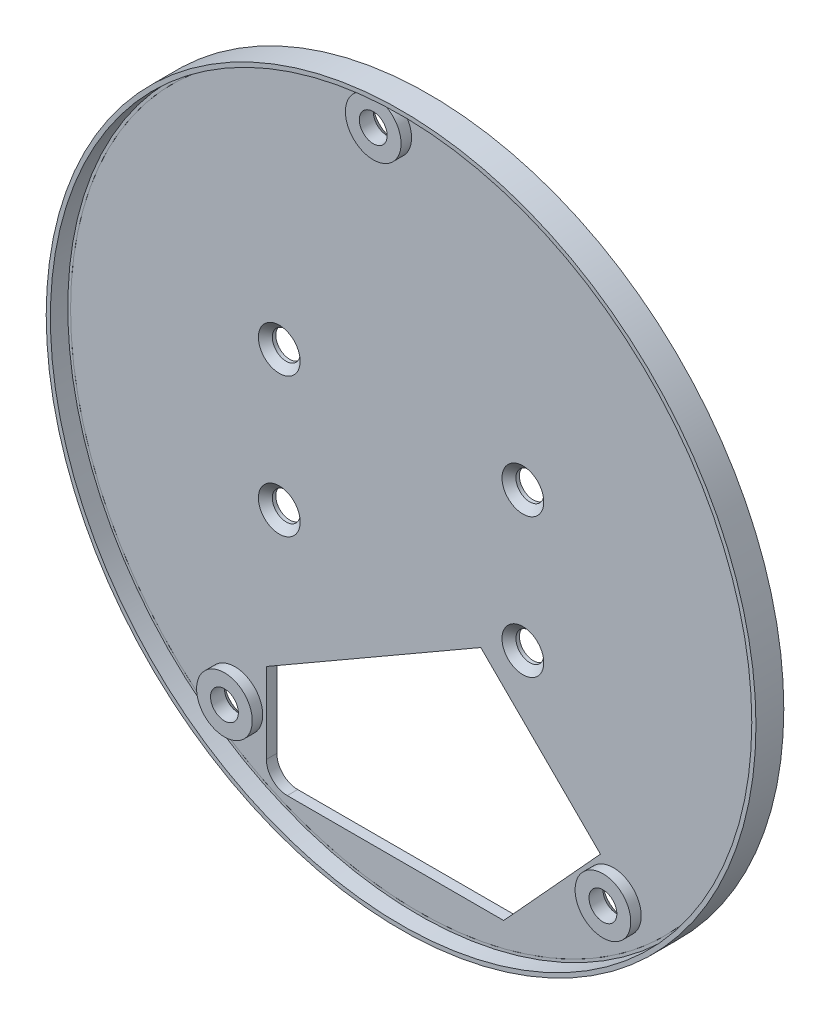
ISO-10303-21;
HEADER;
FILE_DESCRIPTION(('STEP AP214'),'2;1');
FILE_NAME('part.step','',(''),(''),'','','');
FILE_SCHEMA(('AUTOMOTIVE_DESIGN { 1 0 10303 214 1 1 1 1 }'));
ENDSEC;
DATA;
#1=APPLICATION_CONTEXT('core data for automotive mechanical design processes');
#2=APPLICATION_PROTOCOL_DEFINITION('international standard','automotive_design',2000,#1);
#3=PRODUCT_CONTEXT('',#1,'mechanical');
#4=PRODUCT('Part','Part','',(#3));
#5=PRODUCT_RELATED_PRODUCT_CATEGORY('part','',(#4));
#6=PRODUCT_DEFINITION_FORMATION('','',#4);
#7=PRODUCT_DEFINITION_CONTEXT('part definition',#1,'design');
#8=PRODUCT_DEFINITION('design','',#6,#7);
#9=PRODUCT_DEFINITION_SHAPE('','',#8);
#10=(LENGTH_UNIT() NAMED_UNIT(*) SI_UNIT(.MILLI.,.METRE.));
#11=(NAMED_UNIT(*) PLANE_ANGLE_UNIT() SI_UNIT($,.RADIAN.));
#12=(NAMED_UNIT(*) SI_UNIT($,.STERADIAN.) SOLID_ANGLE_UNIT());
#13=UNCERTAINTY_MEASURE_WITH_UNIT(LENGTH_MEASURE(1.E-05),#10,'distance_accuracy_value','');
#14=(GEOMETRIC_REPRESENTATION_CONTEXT(3) GLOBAL_UNCERTAINTY_ASSIGNED_CONTEXT((#13)) GLOBAL_UNIT_ASSIGNED_CONTEXT((#10,
#11,#12)) REPRESENTATION_CONTEXT('',''));
#15=CARTESIAN_POINT('',(0.,0.,0.));
#16=DIRECTION('',(0.,0.,1.));
#17=DIRECTION('',(1.,0.,0.));
#18=AXIS2_PLACEMENT_3D('',#15,#16,#17);
#19=CARTESIAN_POINT('',(10.4557775510678,108.290889666324,1.));
#20=DIRECTION('',(0.,0.,-1.));
#21=DIRECTION('',(-1.,0.,0.));
#22=AXIS2_PLACEMENT_3D('',#19,#20,#21);
#23=CYLINDRICAL_SURFACE('',#22,49.987399034794);
#24=CARTESIAN_POINT('',(10.4557775510678,108.290889666324,-3.));
#25=DIRECTION('',(0.,0.,1.));
#26=DIRECTION('',(1.,0.,0.));
#27=AXIS2_PLACEMENT_3D('',#24,#25,#26);
#28=CIRCLE('',#27,49.987399034794);
#29=CARTESIAN_POINT('',(60.4431765858618,108.290889666324,-3.));
#30=VERTEX_POINT('',#29);
#31=EDGE_CURVE('E56',#30,#30,#28,.T.);
#32=ORIENTED_EDGE('',*,*,#31,.F.);
#33=EDGE_LOOP('',(#32));
#34=FACE_BOUND('',#33,.T.);
#35=CARTESIAN_POINT('',(10.4557775510678,108.290889666324,-1.5));
#36=DIRECTION('',(0.,0.,1.));
#37=DIRECTION('',(1.,0.,0.));
#38=AXIS2_PLACEMENT_3D('',#35,#36,#37);
#39=CIRCLE('',#38,49.987399034794);
#40=CARTESIAN_POINT('',(60.4431765858618,108.290889666324,-1.5));
#41=VERTEX_POINT('',#40);
#42=EDGE_CURVE('E47',#41,#41,#39,.T.);
#43=ORIENTED_EDGE('',*,*,#42,.T.);
#44=EDGE_LOOP('',(#43));
#45=FACE_BOUND('',#44,.T.);
#46=ADVANCED_FACE('F43',(#34,#45),#23,.F.);
#47=CARTESIAN_POINT('',(10.4557775510678,108.290889666324,1.));
#48=DIRECTION('',(0.,0.,1.));
#49=DIRECTION('',(1.,0.,0.));
#50=AXIS2_PLACEMENT_3D('',#47,#48,#49);
#51=PLANE('',#50);
#52=CARTESIAN_POINT('',(10.4557775510678,108.290889666324,1.));
#53=DIRECTION('',(0.,0.,1.));
#54=DIRECTION('',(1.,0.,0.));
#55=AXIS2_PLACEMENT_3D('',#52,#53,#54);
#56=CIRCLE('',#55,50.387399034794);
#57=CARTESIAN_POINT('',(60.8431765858618,108.290889666324,1.));
#58=VERTEX_POINT('',#57);
#59=EDGE_CURVE('E60',#58,#58,#56,.T.);
#60=ORIENTED_EDGE('',*,*,#59,.F.);
#61=EDGE_LOOP('',(#60));
#62=FACE_BOUND('',#61,.T.);
#63=CARTESIAN_POINT('',(10.4557775510678,108.290889666324,1.));
#64=DIRECTION('',(0.,0.,1.));
#65=DIRECTION('',(1.,0.,0.));
#66=AXIS2_PLACEMENT_3D('',#63,#64,#65);
#67=CIRCLE('',#66,50.987399034794);
#68=CARTESIAN_POINT('',(61.4431765858618,108.290889666324,1.));
#69=VERTEX_POINT('',#68);
#70=EDGE_CURVE('E11',#69,#69,#67,.T.);
#71=ORIENTED_EDGE('',*,*,#70,.T.);
#72=EDGE_LOOP('',(#71));
#73=FACE_BOUND('',#72,.T.);
#74=ADVANCED_FACE('F81',(#62,#73),#51,.T.);
#75=CARTESIAN_POINT('',(10.4557775510678,108.290889666324,-3.));
#76=DIRECTION('',(0.,0.,1.));
#77=DIRECTION('',(1.,0.,0.));
#78=AXIS2_PLACEMENT_3D('',#75,#76,#77);
#79=PLANE('',#78);
#80=CARTESIAN_POINT('',(10.4557775510678,108.290889666324,-3.));
#81=DIRECTION('',(0.,0.,1.));
#82=DIRECTION('',(1.,0.,0.));
#83=AXIS2_PLACEMENT_3D('',#80,#81,#82);
#84=CIRCLE('',#83,50.987399034794);
#85=CARTESIAN_POINT('',(61.4431765858618,108.290889666324,-3.));
#86=VERTEX_POINT('',#85);
#87=EDGE_CURVE('E51',#86,#86,#84,.T.);
#88=ORIENTED_EDGE('',*,*,#87,.F.);
#89=EDGE_LOOP('',(#88));
#90=FACE_BOUND('',#89,.T.);
#91=ORIENTED_EDGE('',*,*,#31,.T.);
#92=EDGE_LOOP('',(#91));
#93=FACE_BOUND('',#92,.T.);
#94=ADVANCED_FACE('F87',(#90,#93),#79,.F.);
#95=CARTESIAN_POINT('',(10.4557775510678,108.290889666324,1.));
#96=DIRECTION('',(0.,0.,-1.));
#97=DIRECTION('',(-1.,0.,0.));
#98=AXIS2_PLACEMENT_3D('',#95,#96,#97);
#99=CYLINDRICAL_SURFACE('',#98,50.987399034794);
#100=ORIENTED_EDGE('',*,*,#70,.F.);
#101=EDGE_LOOP('',(#100));
#102=FACE_BOUND('',#101,.T.);
#103=ORIENTED_EDGE('',*,*,#87,.T.);
#104=EDGE_LOOP('',(#103));
#105=FACE_BOUND('',#104,.T.);
#106=ADVANCED_FACE('F45',(#102,#105),#99,.T.);
#107=CARTESIAN_POINT('',(10.4557775510678,108.290889666324,-1.5));
#108=DIRECTION('',(0.,0.,1.));
#109=DIRECTION('',(1.,0.,0.));
#110=AXIS2_PLACEMENT_3D('',#107,#108,#109);
#111=CYLINDRICAL_SURFACE('',#110,50.387399034794);
#112=CARTESIAN_POINT('',(10.4557775510678,108.290889666324,-1.5));
#113=DIRECTION('',(0.,0.,1.));
#114=DIRECTION('',(1.,0.,0.));
#115=AXIS2_PLACEMENT_3D('',#112,#113,#114);
#116=CIRCLE('',#115,50.387399034794);
#117=CARTESIAN_POINT('',(60.8431765858618,108.290889666324,-1.5));
#118=VERTEX_POINT('',#117);
#119=EDGE_CURVE('E63',#118,#118,#116,.T.);
#120=ORIENTED_EDGE('',*,*,#119,.F.);
#121=EDGE_LOOP('',(#120));
#122=FACE_BOUND('',#121,.T.);
#123=ORIENTED_EDGE('',*,*,#59,.T.);
#124=EDGE_LOOP('',(#123));
#125=FACE_BOUND('',#124,.T.);
#126=ADVANCED_FACE('F73',(#122,#125),#111,.F.);
#127=CARTESIAN_POINT('',(10.4557775510678,108.290889666324,-1.5));
#128=DIRECTION('',(0.,0.,1.));
#129=DIRECTION('',(1.,0.,0.));
#130=AXIS2_PLACEMENT_3D('',#127,#128,#129);
#131=PLANE('',#130);
#132=ORIENTED_EDGE('',*,*,#42,.F.);
#133=EDGE_LOOP('',(#132));
#134=FACE_BOUND('',#133,.T.);
#135=ORIENTED_EDGE('',*,*,#119,.T.);
#136=EDGE_LOOP('',(#135));
#137=FACE_BOUND('',#136,.T.);
#138=ADVANCED_FACE('F71',(#134,#137),#131,.T.);
#139=CLOSED_SHELL('',(#46,#74,#94,#106,#126,#138));
#140=MANIFOLD_SOLID_BREP('B2',#139);
#141=CARTESIAN_POINT('',(5.45576739104778,154.110981106507,0.));
#142=DIRECTION('',(0.,0.,-1.));
#143=DIRECTION('',(-1.,0.,0.));
#144=AXIS2_PLACEMENT_3D('',#141,#142,#143);
#145=PLANE('',#144);
#146=CARTESIAN_POINT('',(5.45576739104778,154.110981106507,0.));
#147=DIRECTION('',(0.,0.,-1.));
#148=DIRECTION('',(-1.,0.,0.));
#149=AXIS2_PLACEMENT_3D('',#146,#147,#148);
#150=CIRCLE('',#149,2.);
#151=CARTESIAN_POINT('',(3.45576739104778,154.110981106507,0.));
#152=VERTEX_POINT('',#151);
#153=EDGE_CURVE('E437',#152,#152,#150,.T.);
#154=ORIENTED_EDGE('',*,*,#153,.T.);
#155=EDGE_LOOP('',(#154));
#156=FACE_BOUND('',#155,.T.);
#157=CARTESIAN_POINT('',(10.4557775510678,108.290889666324,0.));
#158=DIRECTION('',(0.,0.,-1.));
#159=DIRECTION('',(-1.,0.,0.));
#160=AXIS2_PLACEMENT_3D('',#157,#158,#159);
#161=CIRCLE('',#160,49.9095993276444);
#162=CARTESIAN_POINT('',(3.80786198381975,157.755759257346,0.));
#163=VERTEX_POINT('',#162);
#164=CARTESIAN_POINT('',(6.27879379099904,158.025393903465,0.));
#165=VERTEX_POINT('',#164);
#166=EDGE_CURVE('E202',#163,#165,#161,.T.);
#167=ORIENTED_EDGE('',*,*,#166,.F.);
#168=CARTESIAN_POINT('',(5.45576739104778,154.110981106507,0.));
#169=DIRECTION('',(0.,0.,-1.));
#170=DIRECTION('',(-1.,0.,0.));
#171=AXIS2_PLACEMENT_3D('',#168,#169,#170);
#172=CIRCLE('',#171,4.);
#173=EDGE_CURVE('E439',#165,#163,#172,.T.);
#174=ORIENTED_EDGE('',*,*,#173,.F.);
#175=EDGE_LOOP('',(#167,#174));
#176=FACE_BOUND('',#175,.T.);
#177=ADVANCED_FACE('F135',(#156,#176),#145,.F.);
#178=CARTESIAN_POINT('',(5.45576739104778,154.110981106507,-1.5));
#179=DIRECTION('',(0.,0.,1.));
#180=DIRECTION('',(1.,0.,0.));
#181=AXIS2_PLACEMENT_3D('',#178,#179,#180);
#182=CYLINDRICAL_SURFACE('',#181,4.);
#183=DIRECTION('',(0.,0.,1.));
#184=VECTOR('',#183,1.);
#185=CARTESIAN_POINT('',(6.27879379099904,158.025393903465,-0.25));
#186=LINE('',#185,#184);
#187=CARTESIAN_POINT('',(6.27879379099904,158.025393903465,-1.5));
#188=VERTEX_POINT('',#187);
#189=EDGE_CURVE('E199',#165,#188,#186,.F.);
#190=ORIENTED_EDGE('',*,*,#189,.F.);
#191=ORIENTED_EDGE('',*,*,#173,.T.);
#192=DIRECTION('',(0.,0.,1.));
#193=VECTOR('',#192,1.);
#194=CARTESIAN_POINT('',(3.80786198381975,157.755759257346,-0.25));
#195=LINE('',#194,#193);
#196=CARTESIAN_POINT('',(3.80786198381975,157.755759257346,-1.5));
#197=VERTEX_POINT('',#196);
#198=EDGE_CURVE('E208',#197,#163,#195,.T.);
#199=ORIENTED_EDGE('',*,*,#198,.F.);
#200=CARTESIAN_POINT('',(5.45576739104778,154.110981106507,-1.5));
#201=DIRECTION('',(0.,0.,-1.));
#202=DIRECTION('',(-1.,0.,0.));
#203=AXIS2_PLACEMENT_3D('',#200,#201,#202);
#204=CIRCLE('',#203,4.);
#205=EDGE_CURVE('E214',#197,#188,#204,.F.);
#206=ORIENTED_EDGE('',*,*,#205,.T.);
#207=EDGE_LOOP('',(#190,#191,#199,#206));
#208=FACE_BOUND('',#207,.T.);
#209=ADVANCED_FACE('F217',(#208),#182,.T.);
#210=CARTESIAN_POINT('',(-15.9242757890322,71.6108160061844,0.));
#211=DIRECTION('',(0.,0.,-1.));
#212=DIRECTION('',(-1.,0.,0.));
#213=AXIS2_PLACEMENT_3D('',#210,#211,#212);
#214=PLANE('',#213);
#215=CARTESIAN_POINT('',(-15.9242757890322,71.6108160061844,0.));
#216=DIRECTION('',(0.,0.,-1.));
#217=DIRECTION('',(-1.,0.,0.));
#218=AXIS2_PLACEMENT_3D('',#215,#216,#217);
#219=CIRCLE('',#218,4.00000000000001);
#220=CARTESIAN_POINT('',(-19.9242757890322,71.6108160061844,0.));
#221=VERTEX_POINT('',#220);
#222=EDGE_CURVE('E456',#221,#221,#219,.T.);
#223=ORIENTED_EDGE('',*,*,#222,.F.);
#224=EDGE_LOOP('',(#223));
#225=FACE_BOUND('',#224,.T.);
#226=CARTESIAN_POINT('',(-15.9242757890322,71.6108160061844,0.));
#227=DIRECTION('',(0.,0.,-1.));
#228=DIRECTION('',(-1.,0.,0.));
#229=AXIS2_PLACEMENT_3D('',#226,#227,#228);
#230=CIRCLE('',#229,2.00000381001);
#231=CARTESIAN_POINT('',(-17.9242795990422,71.6108160061844,0.));
#232=VERTEX_POINT('',#231);
#233=EDGE_CURVE('E451',#232,#232,#230,.T.);
#234=ORIENTED_EDGE('',*,*,#233,.T.);
#235=EDGE_LOOP('',(#234));
#236=FACE_BOUND('',#235,.T.);
#237=ADVANCED_FACE('F286',(#225,#236),#214,.F.);
#238=CARTESIAN_POINT('',(-15.9242757890322,71.6108160061844,-1.5));
#239=DIRECTION('',(0.,0.,1.));
#240=DIRECTION('',(1.,0.,0.));
#241=AXIS2_PLACEMENT_3D('',#238,#239,#240);
#242=CYLINDRICAL_SURFACE('',#241,4.00000000000001);
#243=CARTESIAN_POINT('',(-15.9242757890322,71.6108160061844,-1.5));
#244=DIRECTION('',(0.,0.,-1.));
#245=DIRECTION('',(-1.,0.,0.));
#246=AXIS2_PLACEMENT_3D('',#243,#244,#245);
#247=CIRCLE('',#246,4.00000000000001);
#248=CARTESIAN_POINT('',(-19.9242757890322,71.6108160061844,-1.5));
#249=VERTEX_POINT('',#248);
#250=EDGE_CURVE('E225',#249,#249,#247,.T.);
#251=ORIENTED_EDGE('',*,*,#250,.F.);
#252=EDGE_LOOP('',(#251));
#253=FACE_BOUND('',#252,.T.);
#254=ORIENTED_EDGE('',*,*,#222,.T.);
#255=EDGE_LOOP('',(#254));
#256=FACE_BOUND('',#255,.T.);
#257=ADVANCED_FACE('F320',(#253,#256),#242,.T.);
#258=CARTESIAN_POINT('',(-15.9242757890322,71.6108160061844,-1.5));
#259=DIRECTION('',(0.,0.,1.));
#260=DIRECTION('',(1.,0.,0.));
#261=AXIS2_PLACEMENT_3D('',#258,#259,#260);
#262=CYLINDRICAL_SURFACE('',#261,2.00000381001);
#263=CARTESIAN_POINT('',(-15.9242757890322,71.6108160061844,-2.00000000000003));
#264=DIRECTION('',(0.,0.,-1.));
#265=DIRECTION('',(-1.,0.,0.));
#266=AXIS2_PLACEMENT_3D('',#263,#264,#265);
#267=CIRCLE('',#266,2.00000381001);
#268=CARTESIAN_POINT('',(-17.9242795990422,71.6108160061844,-2.00000000000003));
#269=VERTEX_POINT('',#268);
#270=EDGE_CURVE('E237',#269,#269,#267,.T.);
#271=ORIENTED_EDGE('',*,*,#270,.T.);
#272=EDGE_LOOP('',(#271));
#273=FACE_BOUND('',#272,.T.);
#274=ORIENTED_EDGE('',*,*,#233,.F.);
#275=EDGE_LOOP('',(#274));
#276=FACE_BOUND('',#275,.T.);
#277=ADVANCED_FACE('F316',(#273,#276),#262,.F.);
#278=CARTESIAN_POINT('',(10.4557775510678,108.290889666324,-3.));
#279=DIRECTION('',(0.,0.,1.));
#280=DIRECTION('',(1.,0.,0.));
#281=AXIS2_PLACEMENT_3D('',#278,#279,#280);
#282=CYLINDRICAL_SURFACE('',#281,49.987399034794);
#283=CARTESIAN_POINT('',(10.4557775510678,108.290889666324,-3.));
#284=DIRECTION('',(0.,0.,-1.));
#285=DIRECTION('',(-1.,0.,0.));
#286=AXIS2_PLACEMENT_3D('',#283,#284,#285);
#287=CIRCLE('',#286,49.987399034794);
#288=CARTESIAN_POINT('',(-39.5316214837262,108.290889666324,-3.));
#289=VERTEX_POINT('',#288);
#290=EDGE_CURVE('E448',#289,#289,#287,.T.);
#291=ORIENTED_EDGE('',*,*,#290,.F.);
#292=EDGE_LOOP('',(#291));
#293=FACE_BOUND('',#292,.T.);
#294=CARTESIAN_POINT('',(10.4557775510678,108.290889666324,-1.5));
#295=DIRECTION('',(0.,0.,-1.));
#296=DIRECTION('',(-1.,0.,0.));
#297=AXIS2_PLACEMENT_3D('',#294,#295,#296);
#298=CIRCLE('',#297,49.987399034794);
#299=CARTESIAN_POINT('',(-39.5316214837262,108.290889666324,-1.5));
#300=VERTEX_POINT('',#299);
#301=EDGE_CURVE('E447',#300,#300,#298,.T.);
#302=ORIENTED_EDGE('',*,*,#301,.T.);
#303=EDGE_LOOP('',(#302));
#304=FACE_BOUND('',#303,.T.);
#305=ADVANCED_FACE('F309',(#293,#304),#282,.T.);
#306=CARTESIAN_POINT('',(10.4557775510678,108.290889666324,-3.));
#307=DIRECTION('',(0.,0.,-1.));
#308=DIRECTION('',(-1.,0.,0.));
#309=AXIS2_PLACEMENT_3D('',#306,#307,#308);
#310=PLANE('',#309);
#311=CARTESIAN_POINT('',(-9.54422244893222,98.2908896663244,-3.));
#312=DIRECTION('',(0.,0.,-1.));
#313=DIRECTION('',(-1.,0.,0.));
#314=AXIS2_PLACEMENT_3D('',#311,#312,#313);
#315=CIRCLE('',#314,2.);
#316=CARTESIAN_POINT('',(-11.5442224489322,98.2908896663244,-3.));
#317=VERTEX_POINT('',#316);
#318=EDGE_CURVE('E384',#317,#317,#315,.T.);
#319=ORIENTED_EDGE('',*,*,#318,.F.);
#320=EDGE_LOOP('',(#319));
#321=FACE_BOUND('',#320,.T.);
#322=CARTESIAN_POINT('',(25.4557775510678,118.290889666324,-3.));
#323=DIRECTION('',(0.,0.,-1.));
#324=DIRECTION('',(-1.,0.,0.));
#325=AXIS2_PLACEMENT_3D('',#322,#323,#324);
#326=CIRCLE('',#325,2.00000000000001);
#327=CARTESIAN_POINT('',(23.4557775510678,118.290889666324,-3.));
#328=VERTEX_POINT('',#327);
#329=EDGE_CURVE('E381',#328,#328,#326,.T.);
#330=ORIENTED_EDGE('',*,*,#329,.F.);
#331=EDGE_LOOP('',(#330));
#332=FACE_BOUND('',#331,.T.);
#333=CARTESIAN_POINT('',(-9.54422244893222,118.290889666324,-3.));
#334=DIRECTION('',(0.,0.,-1.));
#335=DIRECTION('',(-1.,0.,0.));
#336=AXIS2_PLACEMENT_3D('',#333,#334,#335);
#337=CIRCLE('',#336,2.);
#338=CARTESIAN_POINT('',(-11.5442224489322,118.290889666324,-3.));
#339=VERTEX_POINT('',#338);
#340=EDGE_CURVE('E379',#339,#339,#337,.T.);
#341=ORIENTED_EDGE('',*,*,#340,.F.);
#342=EDGE_LOOP('',(#341));
#343=FACE_BOUND('',#342,.T.);
#344=CARTESIAN_POINT('',(25.4557775510678,98.2908896663244,-3.));
#345=DIRECTION('',(0.,0.,-1.));
#346=DIRECTION('',(-1.,0.,0.));
#347=AXIS2_PLACEMENT_3D('',#344,#345,#346);
#348=CIRCLE('',#347,2.00000000000001);
#349=CARTESIAN_POINT('',(23.4557775510678,98.2908896663244,-3.));
#350=VERTEX_POINT('',#349);
#351=EDGE_CURVE('E215',#350,#350,#348,.T.);
#352=ORIENTED_EDGE('',*,*,#351,.F.);
#353=EDGE_LOOP('',(#352));
#354=FACE_BOUND('',#353,.T.);
#355=CARTESIAN_POINT('',(-8.39622952728543,66.3327997501444,-3.));
#356=DIRECTION('',(0.,0.,-1.));
#357=DIRECTION('',(1.,0.,0.));
#358=AXIS2_PLACEMENT_3D('',#355,#356,#357);
#359=CIRCLE('',#358,3.);
#360=CARTESIAN_POINT('',(-8.39622952728541,63.3327997501444,-3.));
#361=VERTEX_POINT('',#360);
#362=CARTESIAN_POINT('',(-11.3962295272854,66.3327997501444,-3.));
#363=VERTEX_POINT('',#362);
#364=EDGE_CURVE('E159',#361,#363,#359,.T.);
#365=ORIENTED_EDGE('',*,*,#364,.F.);
#366=DIRECTION('',(-1.,0.,0.));
#367=VECTOR('',#366,1.);
#368=CARTESIAN_POINT('',(-1.60924657897222,63.3327997501444,-3.));
#369=LINE('',#368,#367);
#370=CARTESIAN_POINT('',(22.6923790242708,63.3327997501444,-3.));
#371=VERTEX_POINT('',#370);
#372=EDGE_CURVE('E419',#371,#361,#369,.T.);
#373=ORIENTED_EDGE('',*,*,#372,.F.);
#374=DIRECTION('',(-0.674765461401641,-0.738032229715906,0.));
#375=VECTOR('',#374,1.);
#376=CARTESIAN_POINT('',(22.6923790242708,63.3327997501444,-3.));
#377=LINE('',#376,#375);
#378=CARTESIAN_POINT('',(36.5989328929764,78.5432477450159,-3.));
#379=VERTEX_POINT('',#378);
#380=EDGE_CURVE('E416',#379,#371,#377,.T.);
#381=ORIENTED_EDGE('',*,*,#380,.F.);
#382=DIRECTION('',(0.708741802615886,-0.705467970374832,0.));
#383=VECTOR('',#382,1.);
#384=CARTESIAN_POINT('',(36.5989328929764,78.5432477450159,-3.));
#385=LINE('',#384,#383);
#386=CARTESIAN_POINT('',(19.4088534972198,95.6539224323944,-3.));
#387=VERTEX_POINT('',#386);
#388=EDGE_CURVE('E413',#387,#379,#385,.T.);
#389=ORIENTED_EDGE('',*,*,#388,.F.);
#390=DIRECTION('',(0.866320075019557,0.499489266769676,0.));
#391=VECTOR('',#390,1.);
#392=CARTESIAN_POINT('',(-11.3962295272854,77.8928099101644,-3.));
#393=LINE('',#392,#391);
#394=CARTESIAN_POINT('',(-11.3962295272854,77.8928099101644,-3.));
#395=VERTEX_POINT('',#394);
#396=EDGE_CURVE('E410',#395,#387,#393,.T.);
#397=ORIENTED_EDGE('',*,*,#396,.F.);
#398=DIRECTION('',(0.,1.,0.));
#399=VECTOR('',#398,1.);
#400=CARTESIAN_POINT('',(-11.3962295272854,66.3327997501444,-3.));
#401=LINE('',#400,#399);
#402=EDGE_CURVE('E407',#363,#395,#401,.T.);
#403=ORIENTED_EDGE('',*,*,#402,.F.);
#404=EDGE_LOOP('',(#365,#373,#381,#389,#397,#403));
#405=FACE_BOUND('',#404,.T.);
#406=CARTESIAN_POINT('',(38.4558334311798,73.7908210861944,-3.));
#407=DIRECTION('',(0.,0.,-1.));
#408=DIRECTION('',(-1.,0.,0.));
#409=AXIS2_PLACEMENT_3D('',#406,#407,#408);
#410=CIRCLE('',#409,3.00000381000747);
#411=CARTESIAN_POINT('',(35.4558296211723,73.7908210861944,-3.));
#412=VERTEX_POINT('',#411);
#413=EDGE_CURVE('E231',#412,#412,#410,.F.);
#414=ORIENTED_EDGE('',*,*,#413,.T.);
#415=EDGE_LOOP('',(#414));
#416=FACE_BOUND('',#415,.T.);
#417=CARTESIAN_POINT('',(-15.9242757890322,71.6108160061844,-3.));
#418=DIRECTION('',(0.,0.,-1.));
#419=DIRECTION('',(-1.,0.,0.));
#420=AXIS2_PLACEMENT_3D('',#417,#418,#419);
#421=CIRCLE('',#420,3.00000381000998);
#422=CARTESIAN_POINT('',(-18.9242795990422,71.6108160061844,-3.));
#423=VERTEX_POINT('',#422);
#424=EDGE_CURVE('E222',#423,#423,#421,.F.);
#425=ORIENTED_EDGE('',*,*,#424,.T.);
#426=EDGE_LOOP('',(#425));
#427=FACE_BOUND('',#426,.T.);
#428=CARTESIAN_POINT('',(5.45576739104778,154.110981106507,-3.));
#429=DIRECTION('',(0.,0.,-1.));
#430=DIRECTION('',(-1.,0.,0.));
#431=AXIS2_PLACEMENT_3D('',#428,#429,#430);
#432=CIRCLE('',#431,2.99999999999999);
#433=CARTESIAN_POINT('',(2.45576739104779,154.110981106507,-3.));
#434=VERTEX_POINT('',#433);
#435=EDGE_CURVE('E218',#434,#434,#432,.F.);
#436=ORIENTED_EDGE('',*,*,#435,.T.);
#437=EDGE_LOOP('',(#436));
#438=FACE_BOUND('',#437,.T.);
#439=ORIENTED_EDGE('',*,*,#290,.T.);
#440=EDGE_LOOP('',(#439));
#441=FACE_BOUND('',#440,.T.);
#442=ADVANCED_FACE('F306',(#321,#332,#343,#354,#405,#416,#427,#438,#441),#310,.T.);
#443=CARTESIAN_POINT('',(10.4557775510678,108.290889666324,-1.5));
#444=DIRECTION('',(0.,0.,-1.));
#445=DIRECTION('',(-1.,0.,0.));
#446=AXIS2_PLACEMENT_3D('',#443,#444,#445);
#447=PLANE('',#446);
#448=CARTESIAN_POINT('',(-9.54422244893222,118.290889666324,-1.5));
#449=DIRECTION('',(0.,0.,-1.));
#450=DIRECTION('',(-1.,0.,0.));
#451=AXIS2_PLACEMENT_3D('',#448,#449,#450);
#452=CIRCLE('',#451,3.00000000000002);
#453=CARTESIAN_POINT('',(-12.5442224489322,118.290889666324,-1.5));
#454=VERTEX_POINT('',#453);
#455=EDGE_CURVE('E255',#454,#454,#452,.T.);
#456=ORIENTED_EDGE('',*,*,#455,.T.);
#457=EDGE_LOOP('',(#456));
#458=FACE_BOUND('',#457,.T.);
#459=CARTESIAN_POINT('',(-9.54422244893222,98.2908896663244,-1.5));
#460=DIRECTION('',(0.,0.,-1.));
#461=DIRECTION('',(-1.,0.,0.));
#462=AXIS2_PLACEMENT_3D('',#459,#460,#461);
#463=CIRCLE('',#462,3.00000000000002);
#464=CARTESIAN_POINT('',(-12.5442224489322,98.2908896663244,-1.5));
#465=VERTEX_POINT('',#464);
#466=EDGE_CURVE('E252',#465,#465,#463,.T.);
#467=ORIENTED_EDGE('',*,*,#466,.T.);
#468=EDGE_LOOP('',(#467));
#469=FACE_BOUND('',#468,.T.);
#470=CARTESIAN_POINT('',(25.4557775510678,98.2908896663244,-1.5));
#471=DIRECTION('',(0.,0.,-1.));
#472=DIRECTION('',(-1.,0.,0.));
#473=AXIS2_PLACEMENT_3D('',#470,#471,#472);
#474=CIRCLE('',#473,2.99999999999998);
#475=CARTESIAN_POINT('',(22.4557775510678,98.2908896663244,-1.5));
#476=VERTEX_POINT('',#475);
#477=EDGE_CURVE('E249',#476,#476,#474,.T.);
#478=ORIENTED_EDGE('',*,*,#477,.T.);
#479=EDGE_LOOP('',(#478));
#480=FACE_BOUND('',#479,.T.);
#481=CARTESIAN_POINT('',(25.4557775510678,118.290889666324,-1.5));
#482=DIRECTION('',(0.,0.,-1.));
#483=DIRECTION('',(-1.,0.,0.));
#484=AXIS2_PLACEMENT_3D('',#481,#482,#483);
#485=CIRCLE('',#484,2.99999999999998);
#486=CARTESIAN_POINT('',(22.4557775510678,118.290889666324,-1.5));
#487=VERTEX_POINT('',#486);
#488=EDGE_CURVE('E246',#487,#487,#485,.T.);
#489=ORIENTED_EDGE('',*,*,#488,.T.);
#490=EDGE_LOOP('',(#489));
#491=FACE_BOUND('',#490,.T.);
#492=ORIENTED_EDGE('',*,*,#301,.F.);
#493=EDGE_LOOP('',(#492));
#494=FACE_BOUND('',#493,.T.);
#495=CARTESIAN_POINT('',(10.4557775510678,108.290889666324,-1.5));
#496=DIRECTION('',(0.,0.,1.));
#497=DIRECTION('',(1.,0.,0.));
#498=AXIS2_PLACEMENT_3D('',#495,#496,#497);
#499=CIRCLE('',#498,49.9095993276444);
#500=EDGE_CURVE('E151',#188,#197,#499,.T.);
#501=ORIENTED_EDGE('',*,*,#500,.F.);
#502=ORIENTED_EDGE('',*,*,#205,.F.);
#503=EDGE_LOOP('',(#501,#502));
#504=FACE_BOUND('',#503,.T.);
#505=ORIENTED_EDGE('',*,*,#250,.T.);
#506=EDGE_LOOP('',(#505));
#507=FACE_BOUND('',#506,.T.);
#508=CARTESIAN_POINT('',(38.4558334311798,73.7908210861944,-1.5));
#509=DIRECTION('',(0.,0.,-1.));
#510=DIRECTION('',(-1.,0.,0.));
#511=AXIS2_PLACEMENT_3D('',#508,#509,#510);
#512=CIRCLE('',#511,4.00000000000001);
#513=CARTESIAN_POINT('',(34.4558334311798,73.7908210861944,-1.5));
#514=VERTEX_POINT('',#513);
#515=EDGE_CURVE('E219',#514,#514,#512,.F.);
#516=ORIENTED_EDGE('',*,*,#515,.F.);
#517=EDGE_LOOP('',(#516));
#518=FACE_BOUND('',#517,.T.);
#519=DIRECTION('',(1.,0.,0.));
#520=VECTOR('',#519,1.);
#521=CARTESIAN_POINT('',(-1.60924657897222,63.3327997501444,-1.5));
#522=LINE('',#521,#520);
#523=CARTESIAN_POINT('',(-8.39622952728541,63.3327997501444,-1.5));
#524=VERTEX_POINT('',#523);
#525=CARTESIAN_POINT('',(22.6923790242708,63.3327997501444,-1.5));
#526=VERTEX_POINT('',#525);
#527=EDGE_CURVE('E400',#524,#526,#522,.T.);
#528=ORIENTED_EDGE('',*,*,#527,.F.);
#529=CARTESIAN_POINT('',(-8.39622952728543,66.3327997501444,-1.5));
#530=DIRECTION('',(0.,0.,-1.));
#531=DIRECTION('',(-1.,0.,0.));
#532=AXIS2_PLACEMENT_3D('',#529,#530,#531);
#533=CIRCLE('',#532,3.);
#534=CARTESIAN_POINT('',(-11.3962295272854,66.3327997501444,-1.5));
#535=VERTEX_POINT('',#534);
#536=EDGE_CURVE('E403',#535,#524,#533,.F.);
#537=ORIENTED_EDGE('',*,*,#536,.F.);
#538=DIRECTION('',(0.,-1.,0.));
#539=VECTOR('',#538,1.);
#540=CARTESIAN_POINT('',(-11.3962295272854,66.3327997501444,-1.5));
#541=LINE('',#540,#539);
#542=CARTESIAN_POINT('',(-11.3962295272854,77.8928099101644,-1.5));
#543=VERTEX_POINT('',#542);
#544=EDGE_CURVE('E425',#543,#535,#541,.T.);
#545=ORIENTED_EDGE('',*,*,#544,.F.);
#546=DIRECTION('',(-0.866320075019558,-0.499489266769676,0.));
#547=VECTOR('',#546,1.);
#548=CARTESIAN_POINT('',(-11.3962295272854,77.8928099101644,-1.5));
#549=LINE('',#548,#547);
#550=CARTESIAN_POINT('',(19.4088534972198,95.6539224323944,-1.5));
#551=VERTEX_POINT('',#550);
#552=EDGE_CURVE('E392',#551,#543,#549,.T.);
#553=ORIENTED_EDGE('',*,*,#552,.F.);
#554=DIRECTION('',(-0.708741802615885,0.705467970374832,0.));
#555=VECTOR('',#554,1.);
#556=CARTESIAN_POINT('',(36.5989328929764,78.5432477450159,-1.5));
#557=LINE('',#556,#555);
#558=CARTESIAN_POINT('',(36.5989328929764,78.5432477450159,-1.5));
#559=VERTEX_POINT('',#558);
#560=EDGE_CURVE('E394',#559,#551,#557,.T.);
#561=ORIENTED_EDGE('',*,*,#560,.F.);
#562=DIRECTION('',(0.674765461401641,0.738032229715906,0.));
#563=VECTOR('',#562,1.);
#564=CARTESIAN_POINT('',(22.6923790242708,63.3327997501444,-1.5));
#565=LINE('',#564,#563);
#566=EDGE_CURVE('E397',#526,#559,#565,.T.);
#567=ORIENTED_EDGE('',*,*,#566,.F.);
#568=EDGE_LOOP('',(#528,#537,#545,#553,#561,#567));
#569=FACE_BOUND('',#568,.T.);
#570=ADVANCED_FACE('F212',(#458,#469,#480,#491,#494,#504,#507,#518,#569),#447,.F.);
#571=CARTESIAN_POINT('',(38.4558334311798,73.7908210861944,0.));
#572=DIRECTION('',(0.,0.,-1.));
#573=DIRECTION('',(-1.,0.,0.));
#574=AXIS2_PLACEMENT_3D('',#571,#572,#573);
#575=PLANE('',#574);
#576=CARTESIAN_POINT('',(38.4558334311798,73.7908210861944,0.));
#577=DIRECTION('',(0.,0.,-1.));
#578=DIRECTION('',(-1.,0.,0.));
#579=AXIS2_PLACEMENT_3D('',#576,#577,#578);
#580=CIRCLE('',#579,4.00000000000001);
#581=CARTESIAN_POINT('',(34.4558334311798,73.7908210861944,0.));
#582=VERTEX_POINT('',#581);
#583=EDGE_CURVE('E444',#582,#582,#580,.T.);
#584=ORIENTED_EDGE('',*,*,#583,.F.);
#585=EDGE_LOOP('',(#584));
#586=FACE_BOUND('',#585,.T.);
#587=CARTESIAN_POINT('',(38.4558334311798,73.7908210861944,0.));
#588=DIRECTION('',(0.,0.,-1.));
#589=DIRECTION('',(-1.,0.,0.));
#590=AXIS2_PLACEMENT_3D('',#587,#588,#589);
#591=CIRCLE('',#590,2.0000038100075);
#592=CARTESIAN_POINT('',(36.4558296211723,73.7908210861944,0.));
#593=VERTEX_POINT('',#592);
#594=EDGE_CURVE('E441',#593,#593,#591,.T.);
#595=ORIENTED_EDGE('',*,*,#594,.T.);
#596=EDGE_LOOP('',(#595));
#597=FACE_BOUND('',#596,.T.);
#598=ADVANCED_FACE('F299',(#586,#597),#575,.F.);
#599=CARTESIAN_POINT('',(38.4558334311798,73.7908210861944,-1.5));
#600=DIRECTION('',(0.,0.,1.));
#601=DIRECTION('',(1.,0.,0.));
#602=AXIS2_PLACEMENT_3D('',#599,#600,#601);
#603=CYLINDRICAL_SURFACE('',#602,4.00000000000001);
#604=ORIENTED_EDGE('',*,*,#515,.T.);
#605=EDGE_LOOP('',(#604));
#606=FACE_BOUND('',#605,.T.);
#607=ORIENTED_EDGE('',*,*,#583,.T.);
#608=EDGE_LOOP('',(#607));
#609=FACE_BOUND('',#608,.T.);
#610=ADVANCED_FACE('F297',(#606,#609),#603,.T.);
#611=CARTESIAN_POINT('',(38.4558334311798,73.7908210861944,-1.5));
#612=DIRECTION('',(0.,0.,1.));
#613=DIRECTION('',(1.,0.,0.));
#614=AXIS2_PLACEMENT_3D('',#611,#612,#613);
#615=CYLINDRICAL_SURFACE('',#614,2.0000038100075);
#616=CARTESIAN_POINT('',(38.4558334311798,73.7908210861944,-2.00000000000002));
#617=DIRECTION('',(0.,0.,-1.));
#618=DIRECTION('',(-1.,0.,0.));
#619=AXIS2_PLACEMENT_3D('',#616,#617,#618);
#620=CIRCLE('',#619,2.0000038100075);
#621=CARTESIAN_POINT('',(36.4558296211723,73.7908210861944,-2.00000000000002));
#622=VERTEX_POINT('',#621);
#623=EDGE_CURVE('E234',#622,#622,#620,.T.);
#624=ORIENTED_EDGE('',*,*,#623,.T.);
#625=EDGE_LOOP('',(#624));
#626=FACE_BOUND('',#625,.T.);
#627=ORIENTED_EDGE('',*,*,#594,.F.);
#628=EDGE_LOOP('',(#627));
#629=FACE_BOUND('',#628,.T.);
#630=ADVANCED_FACE('F294',(#626,#629),#615,.F.);
#631=CARTESIAN_POINT('',(5.45576739104778,154.110981106507,-1.5));
#632=DIRECTION('',(0.,0.,1.));
#633=DIRECTION('',(1.,0.,0.));
#634=AXIS2_PLACEMENT_3D('',#631,#632,#633);
#635=CYLINDRICAL_SURFACE('',#634,2.);
#636=CARTESIAN_POINT('',(5.45576739104778,154.110981106507,-2.00000000000002));
#637=DIRECTION('',(0.,0.,-1.));
#638=DIRECTION('',(-1.,0.,0.));
#639=AXIS2_PLACEMENT_3D('',#636,#637,#638);
#640=CIRCLE('',#639,2.);
#641=CARTESIAN_POINT('',(3.45576739104778,154.110981106507,-2.00000000000002));
#642=VERTEX_POINT('',#641);
#643=EDGE_CURVE('E240',#642,#642,#640,.T.);
#644=ORIENTED_EDGE('',*,*,#643,.T.);
#645=EDGE_LOOP('',(#644));
#646=FACE_BOUND('',#645,.T.);
#647=ORIENTED_EDGE('',*,*,#153,.F.);
#648=EDGE_LOOP('',(#647));
#649=FACE_BOUND('',#648,.T.);
#650=ADVANCED_FACE('F291',(#646,#649),#635,.F.);
#651=CARTESIAN_POINT('',(38.4558334311798,73.7908210861944,-3.));
#652=DIRECTION('',(0.,0.,-1.));
#653=DIRECTION('',(-1.,0.,0.));
#654=AXIS2_PLACEMENT_3D('',#651,#652,#653);
#655=CONICAL_SURFACE('',#654,3.00000381000747,0.785398163397445);
#656=ORIENTED_EDGE('',*,*,#623,.F.);
#657=EDGE_LOOP('',(#656));
#658=FACE_BOUND('',#657,.T.);
#659=ORIENTED_EDGE('',*,*,#413,.F.);
#660=EDGE_LOOP('',(#659));
#661=FACE_BOUND('',#660,.T.);
#662=ADVANCED_FACE('F329',(#658,#661),#655,.F.);
#663=CARTESIAN_POINT('',(-15.9242757890322,71.6108160061844,-3.));
#664=DIRECTION('',(0.,0.,-1.));
#665=DIRECTION('',(-1.,0.,0.));
#666=AXIS2_PLACEMENT_3D('',#663,#664,#665);
#667=CONICAL_SURFACE('',#666,3.00000381000998,0.785398163397452);
#668=ORIENTED_EDGE('',*,*,#270,.F.);
#669=EDGE_LOOP('',(#668));
#670=FACE_BOUND('',#669,.T.);
#671=ORIENTED_EDGE('',*,*,#424,.F.);
#672=EDGE_LOOP('',(#671));
#673=FACE_BOUND('',#672,.T.);
#674=ADVANCED_FACE('F335',(#670,#673),#667,.F.);
#675=CARTESIAN_POINT('',(5.45576739104778,154.110981106507,-3.));
#676=DIRECTION('',(0.,0.,-1.));
#677=DIRECTION('',(-1.,0.,0.));
#678=AXIS2_PLACEMENT_3D('',#675,#676,#677);
#679=CONICAL_SURFACE('',#678,2.99999999999999,0.785398163397452);
#680=ORIENTED_EDGE('',*,*,#643,.F.);
#681=EDGE_LOOP('',(#680));
#682=FACE_BOUND('',#681,.T.);
#683=ORIENTED_EDGE('',*,*,#435,.F.);
#684=EDGE_LOOP('',(#683));
#685=FACE_BOUND('',#684,.T.);
#686=ADVANCED_FACE('F342',(#682,#685),#679,.F.);
#687=CARTESIAN_POINT('',(-8.39622952728543,66.3327997501444,0.00100000000000013));
#688=DIRECTION('',(0.,0.,-1.));
#689=DIRECTION('',(-1.,0.,0.));
#690=AXIS2_PLACEMENT_3D('',#687,#688,#689);
#691=CYLINDRICAL_SURFACE('',#690,3.);
#692=ORIENTED_EDGE('',*,*,#536,.T.);
#693=DIRECTION('',(0.,0.,-1.));
#694=VECTOR('',#693,1.);
#695=CARTESIAN_POINT('',(-8.39622952728541,63.3327997501444,0.00100000000000013));
#696=LINE('',#695,#694);
#697=EDGE_CURVE('E423',#524,#361,#696,.T.);
#698=ORIENTED_EDGE('',*,*,#697,.T.);
#699=ORIENTED_EDGE('',*,*,#364,.T.);
#700=DIRECTION('',(0.,0.,-1.));
#701=VECTOR('',#700,1.);
#702=CARTESIAN_POINT('',(-11.3962295272854,66.3327997501444,0.00100000000000013));
#703=LINE('',#702,#701);
#704=EDGE_CURVE('E422',#535,#363,#703,.T.);
#705=ORIENTED_EDGE('',*,*,#704,.F.);
#706=EDGE_LOOP('',(#692,#698,#699,#705));
#707=FACE_BOUND('',#706,.T.);
#708=ADVANCED_FACE('F349',(#707),#691,.F.);
#709=CARTESIAN_POINT('',(-1.60924657897222,63.3327997501444,0.00100000000000013));
#710=DIRECTION('',(0.,-1.,0.));
#711=DIRECTION('',(0.,0.,-1.));
#712=AXIS2_PLACEMENT_3D('',#709,#710,#711);
#713=PLANE('',#712);
#714=ORIENTED_EDGE('',*,*,#527,.T.);
#715=DIRECTION('',(0.,0.,-1.));
#716=VECTOR('',#715,1.);
#717=CARTESIAN_POINT('',(22.6923790242708,63.3327997501444,0.00100000000000013));
#718=LINE('',#717,#716);
#719=EDGE_CURVE('E426',#526,#371,#718,.T.);
#720=ORIENTED_EDGE('',*,*,#719,.T.);
#721=ORIENTED_EDGE('',*,*,#372,.T.);
#722=ORIENTED_EDGE('',*,*,#697,.F.);
#723=EDGE_LOOP('',(#714,#720,#721,#722));
#724=FACE_BOUND('',#723,.T.);
#725=ADVANCED_FACE('F474',(#724),#713,.F.);
#726=CARTESIAN_POINT('',(22.6923790242708,63.3327997501444,0.00100000000000013));
#727=DIRECTION('',(0.738032229715906,-0.674765461401641,0.));
#728=DIRECTION('',(0.674765461401641,0.738032229715906,0.));
#729=AXIS2_PLACEMENT_3D('',#726,#727,#728);
#730=PLANE('',#729);
#731=ORIENTED_EDGE('',*,*,#566,.T.);
#732=DIRECTION('',(0.,0.,-1.));
#733=VECTOR('',#732,1.);
#734=CARTESIAN_POINT('',(36.5989328929764,78.5432477450159,0.00100000000000013));
#735=LINE('',#734,#733);
#736=EDGE_CURVE('E428',#559,#379,#735,.T.);
#737=ORIENTED_EDGE('',*,*,#736,.T.);
#738=ORIENTED_EDGE('',*,*,#380,.T.);
#739=ORIENTED_EDGE('',*,*,#719,.F.);
#740=EDGE_LOOP('',(#731,#737,#738,#739));
#741=FACE_BOUND('',#740,.T.);
#742=ADVANCED_FACE('F489',(#741),#730,.F.);
#743=CARTESIAN_POINT('',(36.5989328929764,78.5432477450159,0.00100000000000013));
#744=DIRECTION('',(0.705467970374832,0.708741802615885,0.));
#745=DIRECTION('',(-0.708741802615885,0.705467970374832,0.));
#746=AXIS2_PLACEMENT_3D('',#743,#744,#745);
#747=PLANE('',#746);
#748=ORIENTED_EDGE('',*,*,#560,.T.);
#749=DIRECTION('',(0.,0.,-1.));
#750=VECTOR('',#749,1.);
#751=CARTESIAN_POINT('',(19.4088534972198,95.6539224323944,0.00100000000000013));
#752=LINE('',#751,#750);
#753=EDGE_CURVE('E430',#551,#387,#752,.T.);
#754=ORIENTED_EDGE('',*,*,#753,.T.);
#755=ORIENTED_EDGE('',*,*,#388,.T.);
#756=ORIENTED_EDGE('',*,*,#736,.F.);
#757=EDGE_LOOP('',(#748,#754,#755,#756));
#758=FACE_BOUND('',#757,.T.);
#759=ADVANCED_FACE('F486',(#758),#747,.F.);
#760=CARTESIAN_POINT('',(-11.3962295272854,77.8928099101644,0.00100000000000013));
#761=DIRECTION('',(-0.499489266769676,0.866320075019557,0.));
#762=DIRECTION('',(-0.866320075019558,-0.499489266769676,0.));
#763=AXIS2_PLACEMENT_3D('',#760,#761,#762);
#764=PLANE('',#763);
#765=ORIENTED_EDGE('',*,*,#552,.T.);
#766=DIRECTION('',(0.,0.,-1.));
#767=VECTOR('',#766,1.);
#768=CARTESIAN_POINT('',(-11.3962295272854,77.8928099101644,0.00100000000000013));
#769=LINE('',#768,#767);
#770=EDGE_CURVE('E432',#543,#395,#769,.T.);
#771=ORIENTED_EDGE('',*,*,#770,.T.);
#772=ORIENTED_EDGE('',*,*,#396,.T.);
#773=ORIENTED_EDGE('',*,*,#753,.F.);
#774=EDGE_LOOP('',(#765,#771,#772,#773));
#775=FACE_BOUND('',#774,.T.);
#776=ADVANCED_FACE('F482',(#775),#764,.F.);
#777=CARTESIAN_POINT('',(-11.3962295272854,66.3327997501444,0.00100000000000013));
#778=DIRECTION('',(-1.,0.,0.));
#779=DIRECTION('',(0.,0.,1.));
#780=AXIS2_PLACEMENT_3D('',#777,#778,#779);
#781=PLANE('',#780);
#782=ORIENTED_EDGE('',*,*,#544,.T.);
#783=ORIENTED_EDGE('',*,*,#704,.T.);
#784=ORIENTED_EDGE('',*,*,#402,.T.);
#785=ORIENTED_EDGE('',*,*,#770,.F.);
#786=EDGE_LOOP('',(#782,#783,#784,#785));
#787=FACE_BOUND('',#786,.T.);
#788=ADVANCED_FACE('F479',(#787),#781,.F.);
#789=CARTESIAN_POINT('',(10.4557775510678,108.290889666324,-1.5));
#790=DIRECTION('',(0.,0.,1.));
#791=DIRECTION('',(1.,0.,0.));
#792=AXIS2_PLACEMENT_3D('',#789,#790,#791);
#793=CYLINDRICAL_SURFACE('',#792,49.9095993276444);
#794=ORIENTED_EDGE('',*,*,#189,.T.);
#795=ORIENTED_EDGE('',*,*,#500,.T.);
#796=ORIENTED_EDGE('',*,*,#198,.T.);
#797=ORIENTED_EDGE('',*,*,#166,.T.);
#798=EDGE_LOOP('',(#794,#795,#796,#797));
#799=FACE_BOUND('',#798,.T.);
#800=ADVANCED_FACE('F200',(#799),#793,.T.);
#801=CARTESIAN_POINT('',(25.4557775510678,98.2908896663244,1.001));
#802=DIRECTION('',(0.,0.,-1.));
#803=DIRECTION('',(-1.,0.,0.));
#804=AXIS2_PLACEMENT_3D('',#801,#802,#803);
#805=CYLINDRICAL_SURFACE('',#804,2.00000000000001);
#806=CARTESIAN_POINT('',(25.4557775510678,98.2908896663244,-2.49999999999996));
#807=DIRECTION('',(0.,0.,-1.));
#808=DIRECTION('',(-1.,0.,0.));
#809=AXIS2_PLACEMENT_3D('',#806,#807,#808);
#810=CIRCLE('',#809,2.00000000000001);
#811=CARTESIAN_POINT('',(23.4557775510678,98.2908896663244,-2.49999999999996));
#812=VERTEX_POINT('',#811);
#813=EDGE_CURVE('E144',#812,#812,#810,.F.);
#814=ORIENTED_EDGE('',*,*,#813,.T.);
#815=EDGE_LOOP('',(#814));
#816=FACE_BOUND('',#815,.T.);
#817=ORIENTED_EDGE('',*,*,#351,.T.);
#818=EDGE_LOOP('',(#817));
#819=FACE_BOUND('',#818,.T.);
#820=ADVANCED_FACE('F263',(#816,#819),#805,.F.);
#821=CARTESIAN_POINT('',(-9.54422244893222,118.290889666324,1.001));
#822=DIRECTION('',(0.,0.,-1.));
#823=DIRECTION('',(-1.,0.,0.));
#824=AXIS2_PLACEMENT_3D('',#821,#822,#823);
#825=CYLINDRICAL_SURFACE('',#824,2.);
#826=CARTESIAN_POINT('',(-9.54422244893222,118.290889666324,-2.50000000000001));
#827=DIRECTION('',(0.,0.,-1.));
#828=DIRECTION('',(-1.,0.,0.));
#829=AXIS2_PLACEMENT_3D('',#826,#827,#828);
#830=CIRCLE('',#829,2.);
#831=CARTESIAN_POINT('',(-11.5442224489322,118.290889666324,-2.50000000000001));
#832=VERTEX_POINT('',#831);
#833=EDGE_CURVE('E207',#832,#832,#830,.F.);
#834=ORIENTED_EDGE('',*,*,#833,.T.);
#835=EDGE_LOOP('',(#834));
#836=FACE_BOUND('',#835,.T.);
#837=ORIENTED_EDGE('',*,*,#340,.T.);
#838=EDGE_LOOP('',(#837));
#839=FACE_BOUND('',#838,.T.);
#840=ADVANCED_FACE('F373',(#836,#839),#825,.F.);
#841=CARTESIAN_POINT('',(25.4557775510678,118.290889666324,1.001));
#842=DIRECTION('',(0.,0.,-1.));
#843=DIRECTION('',(-1.,0.,0.));
#844=AXIS2_PLACEMENT_3D('',#841,#842,#843);
#845=CYLINDRICAL_SURFACE('',#844,2.00000000000001);
#846=CARTESIAN_POINT('',(25.4557775510678,118.290889666324,-2.49999999999996));
#847=DIRECTION('',(0.,0.,-1.));
#848=DIRECTION('',(-1.,0.,0.));
#849=AXIS2_PLACEMENT_3D('',#846,#847,#848);
#850=CIRCLE('',#849,2.00000000000001);
#851=CARTESIAN_POINT('',(23.4557775510678,118.290889666324,-2.49999999999996));
#852=VERTEX_POINT('',#851);
#853=EDGE_CURVE('E41',#852,#852,#850,.F.);
#854=ORIENTED_EDGE('',*,*,#853,.T.);
#855=EDGE_LOOP('',(#854));
#856=FACE_BOUND('',#855,.T.);
#857=ORIENTED_EDGE('',*,*,#329,.T.);
#858=EDGE_LOOP('',(#857));
#859=FACE_BOUND('',#858,.T.);
#860=ADVANCED_FACE('F366',(#856,#859),#845,.F.);
#861=CARTESIAN_POINT('',(-9.54422244893222,98.2908896663244,1.001));
#862=DIRECTION('',(0.,0.,-1.));
#863=DIRECTION('',(-1.,0.,0.));
#864=AXIS2_PLACEMENT_3D('',#861,#862,#863);
#865=CYLINDRICAL_SURFACE('',#864,2.);
#866=CARTESIAN_POINT('',(-9.54422244893222,98.2908896663244,-2.50000000000001));
#867=DIRECTION('',(0.,0.,-1.));
#868=DIRECTION('',(-1.,0.,0.));
#869=AXIS2_PLACEMENT_3D('',#866,#867,#868);
#870=CIRCLE('',#869,2.);
#871=CARTESIAN_POINT('',(-11.5442224489322,98.2908896663244,-2.50000000000001));
#872=VERTEX_POINT('',#871);
#873=EDGE_CURVE('E258',#872,#872,#870,.F.);
#874=ORIENTED_EDGE('',*,*,#873,.T.);
#875=EDGE_LOOP('',(#874));
#876=FACE_BOUND('',#875,.T.);
#877=ORIENTED_EDGE('',*,*,#318,.T.);
#878=EDGE_LOOP('',(#877));
#879=FACE_BOUND('',#878,.T.);
#880=ADVANCED_FACE('F355',(#876,#879),#865,.F.);
#881=CARTESIAN_POINT('',(-9.54422244893222,118.290889666324,-2.50000000000001));
#882=DIRECTION('',(0.,0.,1.));
#883=DIRECTION('',(1.,0.,0.));
#884=AXIS2_PLACEMENT_3D('',#881,#882,#883);
#885=CONICAL_SURFACE('',#884,2.,0.785398163397452);
#886=ORIENTED_EDGE('',*,*,#455,.F.);
#887=EDGE_LOOP('',(#886));
#888=FACE_BOUND('',#887,.T.);
#889=ORIENTED_EDGE('',*,*,#833,.F.);
#890=EDGE_LOOP('',(#889));
#891=FACE_BOUND('',#890,.T.);
#892=ADVANCED_FACE('F275',(#888,#891),#885,.F.);
#893=CARTESIAN_POINT('',(-9.54422244893222,98.2908896663244,-2.50000000000001));
#894=DIRECTION('',(0.,0.,1.));
#895=DIRECTION('',(1.,0.,0.));
#896=AXIS2_PLACEMENT_3D('',#893,#894,#895);
#897=CONICAL_SURFACE('',#896,2.,0.785398163397452);
#898=ORIENTED_EDGE('',*,*,#466,.F.);
#899=EDGE_LOOP('',(#898));
#900=FACE_BOUND('',#899,.T.);
#901=ORIENTED_EDGE('',*,*,#873,.F.);
#902=EDGE_LOOP('',(#901));
#903=FACE_BOUND('',#902,.T.);
#904=ADVANCED_FACE('F268',(#900,#903),#897,.F.);
#905=CARTESIAN_POINT('',(25.4557775510678,98.2908896663244,-2.49999999999996));
#906=DIRECTION('',(0.,0.,1.));
#907=DIRECTION('',(1.,0.,0.));
#908=AXIS2_PLACEMENT_3D('',#905,#906,#907);
#909=CONICAL_SURFACE('',#908,2.00000000000001,0.785398163397452);
#910=ORIENTED_EDGE('',*,*,#477,.F.);
#911=EDGE_LOOP('',(#910));
#912=FACE_BOUND('',#911,.T.);
#913=ORIENTED_EDGE('',*,*,#813,.F.);
#914=EDGE_LOOP('',(#913));
#915=FACE_BOUND('',#914,.T.);
#916=ADVANCED_FACE('F266',(#912,#915),#909,.F.);
#917=CARTESIAN_POINT('',(25.4557775510678,118.290889666324,-2.49999999999996));
#918=DIRECTION('',(0.,0.,1.));
#919=DIRECTION('',(1.,0.,0.));
#920=AXIS2_PLACEMENT_3D('',#917,#918,#919);
#921=CONICAL_SURFACE('',#920,2.00000000000001,0.785398163397452);
#922=ORIENTED_EDGE('',*,*,#488,.F.);
#923=EDGE_LOOP('',(#922));
#924=FACE_BOUND('',#923,.T.);
#925=ORIENTED_EDGE('',*,*,#853,.F.);
#926=EDGE_LOOP('',(#925));
#927=FACE_BOUND('',#926,.T.);
#928=ADVANCED_FACE('F138',(#924,#927),#921,.F.);
#929=CLOSED_SHELL('',(#177,#209,#237,#257,#277,#305,#442,#570,#598,#610,#630,#650,#662,#674,
#686,#708,#725,#742,#759,#776,#788,#800,#820,#840,#860,#880,#892,#904,#916,#928));
#930=MANIFOLD_SOLID_BREP('B6',#929);
#931=ADVANCED_BREP_SHAPE_REPRESENTATION('',(#18,#140,#930),#14);
#932=SHAPE_DEFINITION_REPRESENTATION(#9,#931);
ENDSEC;
END-ISO-10303-21;
